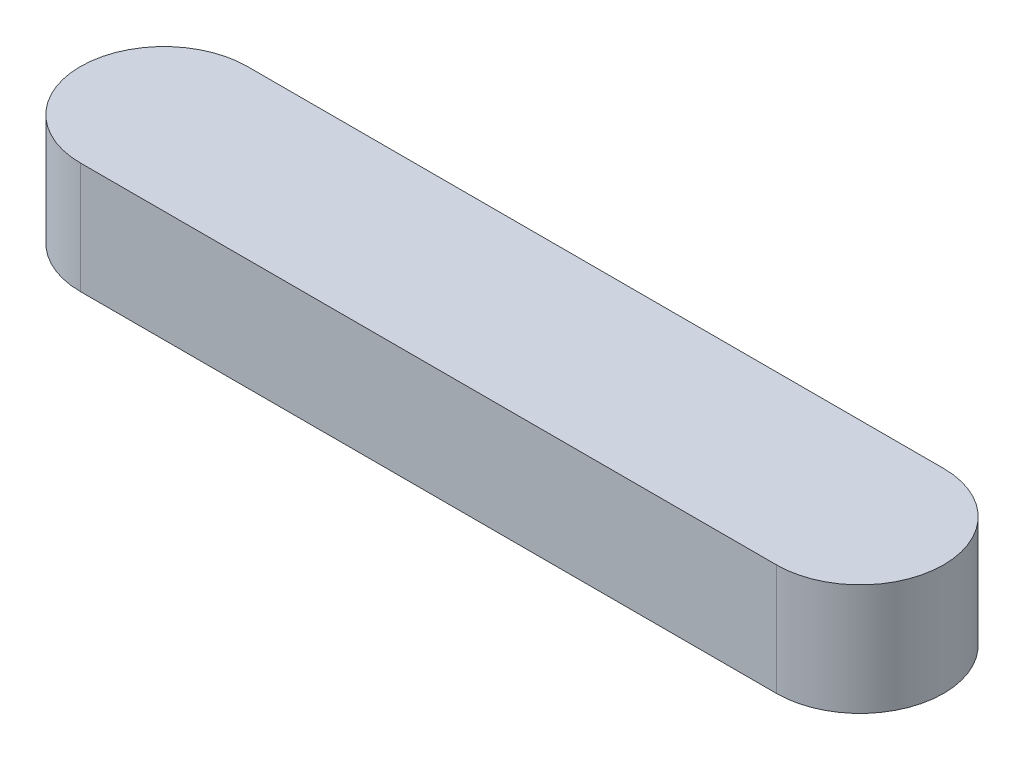
ISO-10303-21;
HEADER;
FILE_DESCRIPTION(('STEP AP214'),'2;1');
FILE_NAME('part.step','',(''),(''),'','','');
FILE_SCHEMA(('AUTOMOTIVE_DESIGN { 1 0 10303 214 1 1 1 1 }'));
ENDSEC;
DATA;
#1=APPLICATION_CONTEXT('core data for automotive mechanical design processes');
#2=APPLICATION_PROTOCOL_DEFINITION('international standard','automotive_design',2000,#1);
#3=PRODUCT_CONTEXT('',#1,'mechanical');
#4=PRODUCT('Part','Part','',(#3));
#5=PRODUCT_RELATED_PRODUCT_CATEGORY('part','',(#4));
#6=PRODUCT_DEFINITION_FORMATION('','',#4);
#7=PRODUCT_DEFINITION_CONTEXT('part definition',#1,'design');
#8=PRODUCT_DEFINITION('design','',#6,#7);
#9=PRODUCT_DEFINITION_SHAPE('','',#8);
#10=(LENGTH_UNIT() NAMED_UNIT(*) SI_UNIT(.MILLI.,.METRE.));
#11=(NAMED_UNIT(*) PLANE_ANGLE_UNIT() SI_UNIT($,.RADIAN.));
#12=(NAMED_UNIT(*) SI_UNIT($,.STERADIAN.) SOLID_ANGLE_UNIT());
#13=UNCERTAINTY_MEASURE_WITH_UNIT(LENGTH_MEASURE(1.E-05),#10,'distance_accuracy_value','');
#14=(GEOMETRIC_REPRESENTATION_CONTEXT(3) GLOBAL_UNCERTAINTY_ASSIGNED_CONTEXT((#13)) GLOBAL_UNIT_ASSIGNED_CONTEXT((#10,
#11,#12)) REPRESENTATION_CONTEXT('',''));
#15=CARTESIAN_POINT('',(0.,0.,0.));
#16=DIRECTION('',(0.,0.,1.));
#17=DIRECTION('',(1.,0.,0.));
#18=AXIS2_PLACEMENT_3D('',#15,#16,#17);
#19=CARTESIAN_POINT('',(0.,4.,0.));
#20=DIRECTION('',(0.,-1.,0.));
#21=DIRECTION('',(0.,0.,-1.));
#22=AXIS2_PLACEMENT_3D('',#19,#20,#21);
#23=CYLINDRICAL_SURFACE('',#22,3.);
#24=CARTESIAN_POINT('',(0.,0.,0.));
#25=DIRECTION('',(0.,1.,0.));
#26=DIRECTION('',(0.,0.,1.));
#27=AXIS2_PLACEMENT_3D('',#24,#25,#26);
#28=CIRCLE('',#27,3.);
#29=CARTESIAN_POINT('',(0.,0.,-3.));
#30=VERTEX_POINT('',#29);
#31=CARTESIAN_POINT('',(0.,0.,3.));
#32=VERTEX_POINT('',#31);
#33=EDGE_CURVE('E107',#30,#32,#28,.T.);
#34=ORIENTED_EDGE('',*,*,#33,.T.);
#35=DIRECTION('',(0.,-1.,0.));
#36=VECTOR('',#35,1.);
#37=CARTESIAN_POINT('',(0.,4.,3.));
#38=LINE('',#37,#36);
#39=CARTESIAN_POINT('',(0.,4.,3.));
#40=VERTEX_POINT('',#39);
#41=EDGE_CURVE('E11',#40,#32,#38,.T.);
#42=ORIENTED_EDGE('',*,*,#41,.F.);
#43=CARTESIAN_POINT('',(0.,4.,0.));
#44=DIRECTION('',(0.,1.,0.));
#45=DIRECTION('',(0.,0.,1.));
#46=AXIS2_PLACEMENT_3D('',#43,#44,#45);
#47=CIRCLE('',#46,3.);
#48=CARTESIAN_POINT('',(0.,4.,-3.));
#49=VERTEX_POINT('',#48);
#50=EDGE_CURVE('E91',#49,#40,#47,.T.);
#51=ORIENTED_EDGE('',*,*,#50,.F.);
#52=DIRECTION('',(0.,-1.,0.));
#53=VECTOR('',#52,1.);
#54=CARTESIAN_POINT('',(0.,4.,-3.));
#55=LINE('',#54,#53);
#56=EDGE_CURVE('E103',#49,#30,#55,.T.);
#57=ORIENTED_EDGE('',*,*,#56,.T.);
#58=EDGE_LOOP('',(#34,#42,#51,#57));
#59=FACE_BOUND('',#58,.T.);
#60=ADVANCED_FACE('F39',(#59),#23,.T.);
#61=CARTESIAN_POINT('',(0.,4.,3.));
#62=DIRECTION('',(0.,0.,-1.));
#63=DIRECTION('',(-1.,0.,0.));
#64=AXIS2_PLACEMENT_3D('',#61,#62,#63);
#65=PLANE('',#64);
#66=DIRECTION('',(1.,0.,0.));
#67=VECTOR('',#66,1.);
#68=CARTESIAN_POINT('',(0.,0.,3.));
#69=LINE('',#68,#67);
#70=CARTESIAN_POINT('',(25.,0.,3.));
#71=VERTEX_POINT('',#70);
#72=EDGE_CURVE('E96',#32,#71,#69,.T.);
#73=ORIENTED_EDGE('',*,*,#72,.T.);
#74=DIRECTION('',(0.,-1.,0.));
#75=VECTOR('',#74,1.);
#76=CARTESIAN_POINT('',(25.,4.,3.));
#77=LINE('',#76,#75);
#78=CARTESIAN_POINT('',(25.,4.,3.));
#79=VERTEX_POINT('',#78);
#80=EDGE_CURVE('E48',#79,#71,#77,.T.);
#81=ORIENTED_EDGE('',*,*,#80,.F.);
#82=DIRECTION('',(1.,0.,0.));
#83=VECTOR('',#82,1.);
#84=CARTESIAN_POINT('',(0.,4.,3.));
#85=LINE('',#84,#83);
#86=EDGE_CURVE('E86',#40,#79,#85,.T.);
#87=ORIENTED_EDGE('',*,*,#86,.F.);
#88=ORIENTED_EDGE('',*,*,#41,.T.);
#89=EDGE_LOOP('',(#73,#81,#87,#88));
#90=FACE_BOUND('',#89,.T.);
#91=ADVANCED_FACE('F95',(#90),#65,.F.);
#92=CARTESIAN_POINT('',(25.,4.,0.));
#93=DIRECTION('',(0.,-1.,0.));
#94=DIRECTION('',(0.,0.,-1.));
#95=AXIS2_PLACEMENT_3D('',#92,#93,#94);
#96=CYLINDRICAL_SURFACE('',#95,3.);
#97=CARTESIAN_POINT('',(25.,0.,0.));
#98=DIRECTION('',(0.,1.,0.));
#99=DIRECTION('',(0.,0.,1.));
#100=AXIS2_PLACEMENT_3D('',#97,#98,#99);
#101=CIRCLE('',#100,3.);
#102=CARTESIAN_POINT('',(25.,0.,-3.));
#103=VERTEX_POINT('',#102);
#104=EDGE_CURVE('E73',#71,#103,#101,.T.);
#105=ORIENTED_EDGE('',*,*,#104,.T.);
#106=DIRECTION('',(0.,-1.,0.));
#107=VECTOR('',#106,1.);
#108=CARTESIAN_POINT('',(25.,4.,-3.));
#109=LINE('',#108,#107);
#110=CARTESIAN_POINT('',(25.,4.,-3.));
#111=VERTEX_POINT('',#110);
#112=EDGE_CURVE('E98',#111,#103,#109,.T.);
#113=ORIENTED_EDGE('',*,*,#112,.F.);
#114=CARTESIAN_POINT('',(25.,4.,0.));
#115=DIRECTION('',(0.,1.,0.));
#116=DIRECTION('',(0.,0.,1.));
#117=AXIS2_PLACEMENT_3D('',#114,#115,#116);
#118=CIRCLE('',#117,3.);
#119=EDGE_CURVE('E89',#79,#111,#118,.T.);
#120=ORIENTED_EDGE('',*,*,#119,.F.);
#121=ORIENTED_EDGE('',*,*,#80,.T.);
#122=EDGE_LOOP('',(#105,#113,#120,#121));
#123=FACE_BOUND('',#122,.T.);
#124=ADVANCED_FACE('F99',(#123),#96,.T.);
#125=CARTESIAN_POINT('',(0.,4.,-3.));
#126=DIRECTION('',(0.,0.,1.));
#127=DIRECTION('',(1.,0.,0.));
#128=AXIS2_PLACEMENT_3D('',#125,#126,#127);
#129=PLANE('',#128);
#130=DIRECTION('',(-1.,0.,0.));
#131=VECTOR('',#130,1.);
#132=CARTESIAN_POINT('',(0.,0.,-3.));
#133=LINE('',#132,#131);
#134=EDGE_CURVE('E79',#103,#30,#133,.T.);
#135=ORIENTED_EDGE('',*,*,#134,.T.);
#136=ORIENTED_EDGE('',*,*,#56,.F.);
#137=DIRECTION('',(-1.,0.,0.));
#138=VECTOR('',#137,1.);
#139=CARTESIAN_POINT('',(0.,4.,-3.));
#140=LINE('',#139,#138);
#141=EDGE_CURVE('E56',#111,#49,#140,.T.);
#142=ORIENTED_EDGE('',*,*,#141,.F.);
#143=ORIENTED_EDGE('',*,*,#112,.T.);
#144=EDGE_LOOP('',(#135,#136,#142,#143));
#145=FACE_BOUND('',#144,.T.);
#146=ADVANCED_FACE('F120',(#145),#129,.F.);
#147=CARTESIAN_POINT('',(0.,4.,0.));
#148=DIRECTION('',(0.,1.,0.));
#149=DIRECTION('',(0.,0.,1.));
#150=AXIS2_PLACEMENT_3D('',#147,#148,#149);
#151=PLANE('',#150);
#152=ORIENTED_EDGE('',*,*,#50,.T.);
#153=ORIENTED_EDGE('',*,*,#86,.T.);
#154=ORIENTED_EDGE('',*,*,#119,.T.);
#155=ORIENTED_EDGE('',*,*,#141,.T.);
#156=EDGE_LOOP('',(#152,#153,#154,#155));
#157=FACE_BOUND('',#156,.T.);
#158=ADVANCED_FACE('F87',(#157),#151,.T.);
#159=CARTESIAN_POINT('',(0.,0.,0.));
#160=DIRECTION('',(0.,1.,0.));
#161=DIRECTION('',(0.,0.,1.));
#162=AXIS2_PLACEMENT_3D('',#159,#160,#161);
#163=PLANE('',#162);
#164=ORIENTED_EDGE('',*,*,#33,.F.);
#165=ORIENTED_EDGE('',*,*,#134,.F.);
#166=ORIENTED_EDGE('',*,*,#104,.F.);
#167=ORIENTED_EDGE('',*,*,#72,.F.);
#168=EDGE_LOOP('',(#164,#165,#166,#167));
#169=FACE_BOUND('',#168,.T.);
#170=ADVANCED_FACE('F123',(#169),#163,.F.);
#171=CLOSED_SHELL('',(#60,#91,#124,#146,#158,#170));
#172=MANIFOLD_SOLID_BREP('B2',#171);
#173=ADVANCED_BREP_SHAPE_REPRESENTATION('',(#18,#172),#14);
#174=SHAPE_DEFINITION_REPRESENTATION(#9,#173);
ENDSEC;
END-ISO-10303-21;
